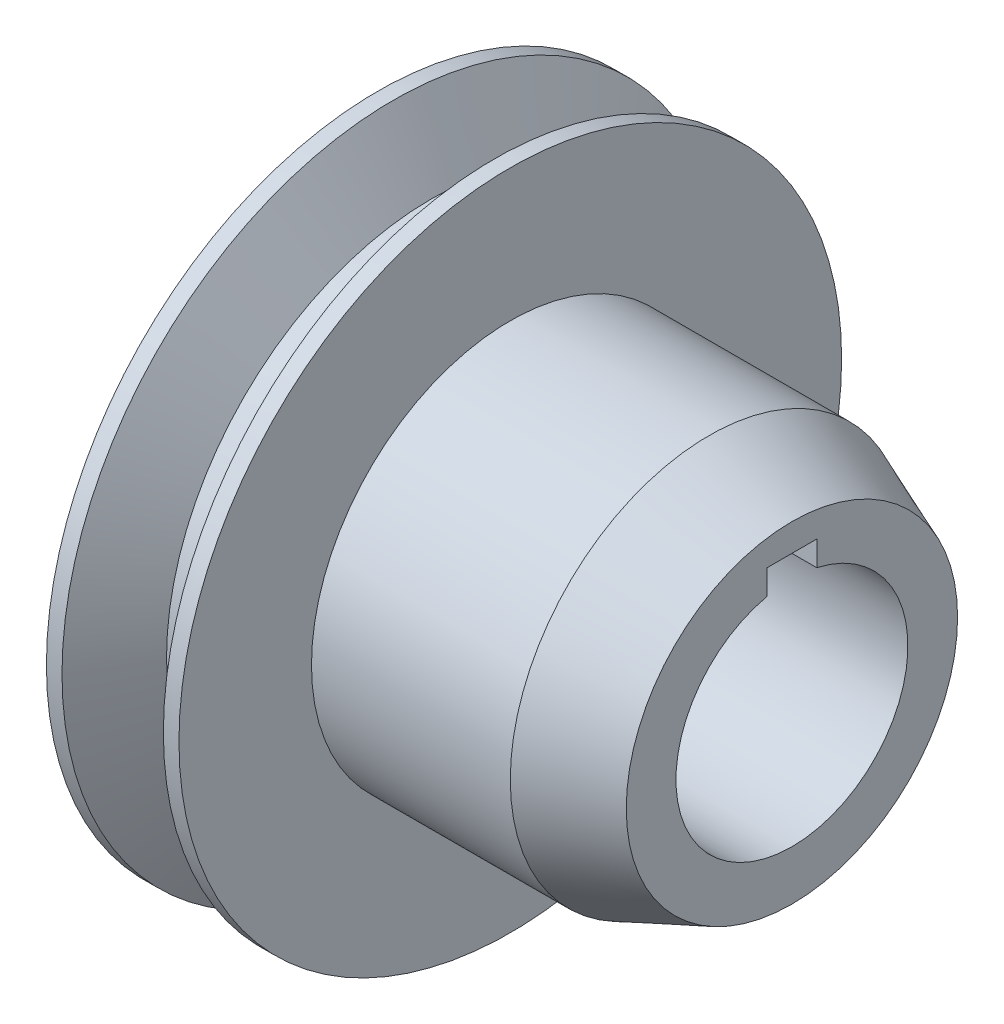
ISO-10303-21;
HEADER;
FILE_DESCRIPTION(('STEP AP214'),'2;1');
FILE_NAME('part.step','',(''),(''),'','','');
FILE_SCHEMA(('AUTOMOTIVE_DESIGN { 1 0 10303 214 1 1 1 1 }'));
ENDSEC;
DATA;
#1=APPLICATION_CONTEXT('core data for automotive mechanical design processes');
#2=APPLICATION_PROTOCOL_DEFINITION('international standard','automotive_design',2000,#1);
#3=PRODUCT_CONTEXT('',#1,'mechanical');
#4=PRODUCT('Part','Part','',(#3));
#5=PRODUCT_RELATED_PRODUCT_CATEGORY('part','',(#4));
#6=PRODUCT_DEFINITION_FORMATION('','',#4);
#7=PRODUCT_DEFINITION_CONTEXT('part definition',#1,'design');
#8=PRODUCT_DEFINITION('design','',#6,#7);
#9=PRODUCT_DEFINITION_SHAPE('','',#8);
#10=(LENGTH_UNIT() NAMED_UNIT(*) SI_UNIT(.MILLI.,.METRE.));
#11=(NAMED_UNIT(*) PLANE_ANGLE_UNIT() SI_UNIT($,.RADIAN.));
#12=(NAMED_UNIT(*) SI_UNIT($,.STERADIAN.) SOLID_ANGLE_UNIT());
#13=UNCERTAINTY_MEASURE_WITH_UNIT(LENGTH_MEASURE(1.E-05),#10,'distance_accuracy_value','');
#14=(GEOMETRIC_REPRESENTATION_CONTEXT(3) GLOBAL_UNCERTAINTY_ASSIGNED_CONTEXT((#13)) GLOBAL_UNIT_ASSIGNED_CONTEXT((#10,
#11,#12)) REPRESENTATION_CONTEXT('',''));
#15=CARTESIAN_POINT('',(0.,0.,0.));
#16=DIRECTION('',(0.,0.,1.));
#17=DIRECTION('',(1.,0.,0.));
#18=AXIS2_PLACEMENT_3D('',#15,#16,#17);
#19=CARTESIAN_POINT('',(-19.7924924362667,0.,0.));
#20=DIRECTION('',(-1.,0.,0.));
#21=DIRECTION('',(0.,0.,1.));
#22=AXIS2_PLACEMENT_3D('',#19,#20,#21);
#23=CYLINDRICAL_SURFACE('',#22,20.);
#24=CARTESIAN_POINT('',(-4.,0.,0.));
#25=DIRECTION('',(-1.,0.,0.));
#26=DIRECTION('',(0.,0.,1.));
#27=AXIS2_PLACEMENT_3D('',#24,#25,#26);
#28=CIRCLE('',#27,20.);
#29=CARTESIAN_POINT('',(-4.,0.,20.));
#30=VERTEX_POINT('',#29);
#31=EDGE_CURVE('E11',#30,#30,#28,.T.);
#32=ORIENTED_EDGE('',*,*,#31,.F.);
#33=EDGE_LOOP('',(#32));
#34=FACE_BOUND('',#33,.T.);
#35=CARTESIAN_POINT('',(-3.05940107675851,0.,0.));
#36=DIRECTION('',(-1.,0.,0.));
#37=DIRECTION('',(0.,0.,1.));
#38=AXIS2_PLACEMENT_3D('',#35,#36,#37);
#39=CIRCLE('',#38,20.);
#40=CARTESIAN_POINT('',(-3.05940107675851,0.,20.));
#41=VERTEX_POINT('',#40);
#42=EDGE_CURVE('E127',#41,#41,#39,.T.);
#43=ORIENTED_EDGE('',*,*,#42,.T.);
#44=EDGE_LOOP('',(#43));
#45=FACE_BOUND('',#44,.T.);
#46=ADVANCED_FACE('F43',(#34,#45),#23,.T.);
#47=CARTESIAN_POINT('',(-4.,20.,0.));
#48=DIRECTION('',(1.,0.,0.));
#49=DIRECTION('',(0.,0.,-1.));
#50=AXIS2_PLACEMENT_3D('',#47,#48,#49);
#51=PLANE('',#50);
#52=CARTESIAN_POINT('',(-4.,0.,0.));
#53=DIRECTION('',(-1.,0.,0.));
#54=DIRECTION('',(0.,0.,1.));
#55=AXIS2_PLACEMENT_3D('',#52,#53,#54);
#56=CIRCLE('',#55,7.);
#57=CARTESIAN_POINT('',(-4.,6.83739716558867,-1.5));
#58=VERTEX_POINT('',#57);
#59=CARTESIAN_POINT('',(-4.,6.83739716558867,1.5));
#60=VERTEX_POINT('',#59);
#61=EDGE_CURVE('E118',#58,#60,#56,.T.);
#62=ORIENTED_EDGE('',*,*,#61,.F.);
#63=DIRECTION('',(0.,-1.,0.));
#64=VECTOR('',#63,1.);
#65=CARTESIAN_POINT('',(-4.,8.33739716558867,-1.5));
#66=LINE('',#65,#64);
#67=CARTESIAN_POINT('',(-4.,8.33739716558867,-1.5));
#68=VERTEX_POINT('',#67);
#69=EDGE_CURVE('E58',#68,#58,#66,.T.);
#70=ORIENTED_EDGE('',*,*,#69,.F.);
#71=DIRECTION('',(0.,0.,-1.));
#72=VECTOR('',#71,1.);
#73=CARTESIAN_POINT('',(-4.,8.33739716558867,-1.5));
#74=LINE('',#73,#72);
#75=CARTESIAN_POINT('',(-4.,8.33739716558867,1.5));
#76=VERTEX_POINT('',#75);
#77=EDGE_CURVE('E105',#76,#68,#74,.T.);
#78=ORIENTED_EDGE('',*,*,#77,.F.);
#79=DIRECTION('',(0.,1.,0.));
#80=VECTOR('',#79,1.);
#81=CARTESIAN_POINT('',(-4.,8.33739716558867,1.5));
#82=LINE('',#81,#80);
#83=EDGE_CURVE('E109',#60,#76,#82,.T.);
#84=ORIENTED_EDGE('',*,*,#83,.F.);
#85=EDGE_LOOP('',(#62,#70,#78,#84));
#86=FACE_BOUND('',#85,.T.);
#87=ORIENTED_EDGE('',*,*,#31,.T.);
#88=EDGE_LOOP('',(#87));
#89=FACE_BOUND('',#88,.T.);
#90=ADVANCED_FACE('F165',(#86,#89),#51,.F.);
#91=CARTESIAN_POINT('',(21.,10.,0.));
#92=DIRECTION('',(-1.,0.,0.));
#93=DIRECTION('',(0.,0.,1.));
#94=AXIS2_PLACEMENT_3D('',#91,#92,#93);
#95=PLANE('',#94);
#96=DIRECTION('',(0.,0.,-1.));
#97=VECTOR('',#96,1.);
#98=CARTESIAN_POINT('',(21.,8.33739716558867,-1.5));
#99=LINE('',#98,#97);
#100=CARTESIAN_POINT('',(21.,8.33739716558867,1.5));
#101=VERTEX_POINT('',#100);
#102=CARTESIAN_POINT('',(21.,8.33739716558867,-1.5));
#103=VERTEX_POINT('',#102);
#104=EDGE_CURVE('E93',#101,#103,#99,.T.);
#105=ORIENTED_EDGE('',*,*,#104,.T.);
#106=DIRECTION('',(0.,-1.,0.));
#107=VECTOR('',#106,1.);
#108=CARTESIAN_POINT('',(21.,8.33739716558867,-1.5));
#109=LINE('',#108,#107);
#110=CARTESIAN_POINT('',(21.,6.83739716558867,-1.5));
#111=VERTEX_POINT('',#110);
#112=EDGE_CURVE('E86',#103,#111,#109,.T.);
#113=ORIENTED_EDGE('',*,*,#112,.T.);
#114=CARTESIAN_POINT('',(21.,0.,0.));
#115=DIRECTION('',(-1.,0.,0.));
#116=DIRECTION('',(0.,0.,1.));
#117=AXIS2_PLACEMENT_3D('',#114,#115,#116);
#118=CIRCLE('',#117,7.);
#119=CARTESIAN_POINT('',(21.,6.83739716558867,1.5));
#120=VERTEX_POINT('',#119);
#121=EDGE_CURVE('E96',#111,#120,#118,.T.);
#122=ORIENTED_EDGE('',*,*,#121,.T.);
#123=DIRECTION('',(0.,1.,0.));
#124=VECTOR('',#123,1.);
#125=CARTESIAN_POINT('',(21.,8.33739716558867,1.5));
#126=LINE('',#125,#124);
#127=EDGE_CURVE('E66',#120,#101,#126,.T.);
#128=ORIENTED_EDGE('',*,*,#127,.T.);
#129=EDGE_LOOP('',(#105,#113,#122,#128));
#130=FACE_BOUND('',#129,.T.);
#131=CARTESIAN_POINT('',(21.,0.,0.));
#132=DIRECTION('',(-1.,0.,0.));
#133=DIRECTION('',(0.,0.,1.));
#134=AXIS2_PLACEMENT_3D('',#131,#132,#133);
#135=CIRCLE('',#134,10.);
#136=CARTESIAN_POINT('',(21.,0.,10.));
#137=VERTEX_POINT('',#136);
#138=EDGE_CURVE('E51',#137,#137,#135,.T.);
#139=ORIENTED_EDGE('',*,*,#138,.F.);
#140=EDGE_LOOP('',(#139));
#141=FACE_BOUND('',#140,.T.);
#142=ADVANCED_FACE('F101',(#130,#141),#95,.F.);
#143=CARTESIAN_POINT('',(21.,0.,0.));
#144=DIRECTION('',(-1.,0.,0.));
#145=DIRECTION('',(0.,0.,1.));
#146=AXIS2_PLACEMENT_3D('',#143,#144,#145);
#147=CONICAL_SURFACE('',#146,10.,0.380506377112365);
#148=CARTESIAN_POINT('',(16.,0.,0.));
#149=DIRECTION('',(-1.,0.,0.));
#150=DIRECTION('',(0.,0.,1.));
#151=AXIS2_PLACEMENT_3D('',#148,#149,#150);
#152=CIRCLE('',#151,12.);
#153=CARTESIAN_POINT('',(16.,0.,12.));
#154=VERTEX_POINT('',#153);
#155=EDGE_CURVE('E156',#154,#154,#152,.T.);
#156=ORIENTED_EDGE('',*,*,#155,.F.);
#157=EDGE_LOOP('',(#156));
#158=FACE_BOUND('',#157,.T.);
#159=ORIENTED_EDGE('',*,*,#138,.T.);
#160=EDGE_LOOP('',(#159));
#161=FACE_BOUND('',#160,.T.);
#162=ADVANCED_FACE('F163',(#158,#161),#147,.T.);
#163=CARTESIAN_POINT('',(-19.7924924362667,0.,0.));
#164=DIRECTION('',(-1.,0.,0.));
#165=DIRECTION('',(0.,0.,1.));
#166=AXIS2_PLACEMENT_3D('',#163,#164,#165);
#167=CYLINDRICAL_SURFACE('',#166,12.);
#168=CARTESIAN_POINT('',(4.,0.,0.));
#169=DIRECTION('',(-1.,0.,0.));
#170=DIRECTION('',(0.,0.,1.));
#171=AXIS2_PLACEMENT_3D('',#168,#169,#170);
#172=CIRCLE('',#171,12.);
#173=CARTESIAN_POINT('',(4.,0.,12.));
#174=VERTEX_POINT('',#173);
#175=EDGE_CURVE('E152',#174,#174,#172,.T.);
#176=ORIENTED_EDGE('',*,*,#175,.F.);
#177=EDGE_LOOP('',(#176));
#178=FACE_BOUND('',#177,.T.);
#179=ORIENTED_EDGE('',*,*,#155,.T.);
#180=EDGE_LOOP('',(#179));
#181=FACE_BOUND('',#180,.T.);
#182=ADVANCED_FACE('F171',(#178,#181),#167,.T.);
#183=CARTESIAN_POINT('',(4.,20.,0.));
#184=DIRECTION('',(-1.,0.,0.));
#185=DIRECTION('',(0.,0.,1.));
#186=AXIS2_PLACEMENT_3D('',#183,#184,#185);
#187=PLANE('',#186);
#188=CARTESIAN_POINT('',(4.,0.,0.));
#189=DIRECTION('',(-1.,0.,0.));
#190=DIRECTION('',(0.,0.,1.));
#191=AXIS2_PLACEMENT_3D('',#188,#189,#190);
#192=CIRCLE('',#191,20.);
#193=CARTESIAN_POINT('',(4.,0.,20.));
#194=VERTEX_POINT('',#193);
#195=EDGE_CURVE('E148',#194,#194,#192,.T.);
#196=ORIENTED_EDGE('',*,*,#195,.F.);
#197=EDGE_LOOP('',(#196));
#198=FACE_BOUND('',#197,.T.);
#199=ORIENTED_EDGE('',*,*,#175,.T.);
#200=EDGE_LOOP('',(#199));
#201=FACE_BOUND('',#200,.T.);
#202=ADVANCED_FACE('F204',(#198,#201),#187,.F.);
#203=CARTESIAN_POINT('',(-19.7924924362667,0.,0.));
#204=DIRECTION('',(-1.,0.,0.));
#205=DIRECTION('',(0.,0.,1.));
#206=AXIS2_PLACEMENT_3D('',#203,#204,#205);
#207=CYLINDRICAL_SURFACE('',#206,20.);
#208=CARTESIAN_POINT('',(3.05940107675851,0.,0.));
#209=DIRECTION('',(-1.,0.,0.));
#210=DIRECTION('',(0.,0.,1.));
#211=AXIS2_PLACEMENT_3D('',#208,#209,#210);
#212=CIRCLE('',#211,20.);
#213=CARTESIAN_POINT('',(3.05940107675851,0.,20.));
#214=VERTEX_POINT('',#213);
#215=EDGE_CURVE('E144',#214,#214,#212,.T.);
#216=ORIENTED_EDGE('',*,*,#215,.F.);
#217=EDGE_LOOP('',(#216));
#218=FACE_BOUND('',#217,.T.);
#219=ORIENTED_EDGE('',*,*,#195,.T.);
#220=EDGE_LOOP('',(#219));
#221=FACE_BOUND('',#220,.T.);
#222=ADVANCED_FACE('F198',(#218,#221),#207,.T.);
#223=CARTESIAN_POINT('',(3.05940107675851,0.,0.));
#224=DIRECTION('',(1.,0.,0.));
#225=DIRECTION('',(0.,0.,-1.));
#226=AXIS2_PLACEMENT_3D('',#223,#224,#225);
#227=CONICAL_SURFACE('',#226,20.,1.0471975511966);
#228=CARTESIAN_POINT('',(0.750000000000001,0.,0.));
#229=DIRECTION('',(-1.,0.,0.));
#230=DIRECTION('',(0.,0.,1.));
#231=AXIS2_PLACEMENT_3D('',#228,#229,#230);
#232=CIRCLE('',#231,16.);
#233=CARTESIAN_POINT('',(0.750000000000001,0.,16.));
#234=VERTEX_POINT('',#233);
#235=EDGE_CURVE('E140',#234,#234,#232,.T.);
#236=ORIENTED_EDGE('',*,*,#235,.F.);
#237=EDGE_LOOP('',(#236));
#238=FACE_BOUND('',#237,.T.);
#239=ORIENTED_EDGE('',*,*,#215,.T.);
#240=EDGE_LOOP('',(#239));
#241=FACE_BOUND('',#240,.T.);
#242=ADVANCED_FACE('F192',(#238,#241),#227,.T.);
#243=CARTESIAN_POINT('',(-19.7924924362667,0.,0.));
#244=DIRECTION('',(-1.,0.,0.));
#245=DIRECTION('',(0.,0.,1.));
#246=AXIS2_PLACEMENT_3D('',#243,#244,#245);
#247=CYLINDRICAL_SURFACE('',#246,16.);
#248=CARTESIAN_POINT('',(-0.750000000000001,0.,0.));
#249=DIRECTION('',(-1.,0.,0.));
#250=DIRECTION('',(0.,0.,1.));
#251=AXIS2_PLACEMENT_3D('',#248,#249,#250);
#252=CIRCLE('',#251,16.);
#253=CARTESIAN_POINT('',(-0.750000000000001,0.,16.));
#254=VERTEX_POINT('',#253);
#255=EDGE_CURVE('E136',#254,#254,#252,.T.);
#256=ORIENTED_EDGE('',*,*,#255,.F.);
#257=EDGE_LOOP('',(#256));
#258=FACE_BOUND('',#257,.T.);
#259=ORIENTED_EDGE('',*,*,#235,.T.);
#260=EDGE_LOOP('',(#259));
#261=FACE_BOUND('',#260,.T.);
#262=ADVANCED_FACE('F186',(#258,#261),#247,.T.);
#263=CARTESIAN_POINT('',(-0.750000000000001,0.,0.));
#264=DIRECTION('',(-1.,0.,0.));
#265=DIRECTION('',(0.,0.,1.));
#266=AXIS2_PLACEMENT_3D('',#263,#264,#265);
#267=CONICAL_SURFACE('',#266,16.,1.0471975511966);
#268=ORIENTED_EDGE('',*,*,#42,.F.);
#269=EDGE_LOOP('',(#268));
#270=FACE_BOUND('',#269,.T.);
#271=ORIENTED_EDGE('',*,*,#255,.T.);
#272=EDGE_LOOP('',(#271));
#273=FACE_BOUND('',#272,.T.);
#274=ADVANCED_FACE('F183',(#270,#273),#267,.T.);
#275=CARTESIAN_POINT('',(21.,8.33739716558867,-1.5));
#276=DIRECTION('',(0.,0.,-1.));
#277=DIRECTION('',(0.,1.,0.));
#278=AXIS2_PLACEMENT_3D('',#275,#276,#277);
#279=PLANE('',#278);
#280=ORIENTED_EDGE('',*,*,#69,.T.);
#281=DIRECTION('',(-1.,0.,0.));
#282=VECTOR('',#281,1.);
#283=CARTESIAN_POINT('',(21.,6.83739716558867,-1.5));
#284=LINE('',#283,#282);
#285=EDGE_CURVE('E82',#111,#58,#284,.T.);
#286=ORIENTED_EDGE('',*,*,#285,.F.);
#287=ORIENTED_EDGE('',*,*,#112,.F.);
#288=DIRECTION('',(-1.,0.,0.));
#289=VECTOR('',#288,1.);
#290=CARTESIAN_POINT('',(21.,8.33739716558867,-1.5));
#291=LINE('',#290,#289);
#292=EDGE_CURVE('E124',#103,#68,#291,.T.);
#293=ORIENTED_EDGE('',*,*,#292,.T.);
#294=EDGE_LOOP('',(#280,#286,#287,#293));
#295=FACE_BOUND('',#294,.T.);
#296=ADVANCED_FACE('F84',(#295),#279,.F.);
#297=CARTESIAN_POINT('',(21.,8.33739716558867,-1.5));
#298=DIRECTION('',(0.,1.,0.));
#299=DIRECTION('',(0.,0.,1.));
#300=AXIS2_PLACEMENT_3D('',#297,#298,#299);
#301=PLANE('',#300);
#302=ORIENTED_EDGE('',*,*,#77,.T.);
#303=ORIENTED_EDGE('',*,*,#292,.F.);
#304=ORIENTED_EDGE('',*,*,#104,.F.);
#305=DIRECTION('',(-1.,0.,0.));
#306=VECTOR('',#305,1.);
#307=CARTESIAN_POINT('',(21.,8.33739716558867,1.5));
#308=LINE('',#307,#306);
#309=EDGE_CURVE('E128',#101,#76,#308,.T.);
#310=ORIENTED_EDGE('',*,*,#309,.T.);
#311=EDGE_LOOP('',(#302,#303,#304,#310));
#312=FACE_BOUND('',#311,.T.);
#313=ADVANCED_FACE('F222',(#312),#301,.F.);
#314=CARTESIAN_POINT('',(21.,8.33739716558867,1.5));
#315=DIRECTION('',(0.,0.,1.));
#316=DIRECTION('',(0.,-1.,0.));
#317=AXIS2_PLACEMENT_3D('',#314,#315,#316);
#318=PLANE('',#317);
#319=ORIENTED_EDGE('',*,*,#83,.T.);
#320=ORIENTED_EDGE('',*,*,#309,.F.);
#321=ORIENTED_EDGE('',*,*,#127,.F.);
#322=DIRECTION('',(-1.,0.,0.));
#323=VECTOR('',#322,1.);
#324=CARTESIAN_POINT('',(21.,6.83739716558867,1.5));
#325=LINE('',#324,#323);
#326=EDGE_CURVE('E92',#120,#60,#325,.T.);
#327=ORIENTED_EDGE('',*,*,#326,.T.);
#328=EDGE_LOOP('',(#319,#320,#321,#327));
#329=FACE_BOUND('',#328,.T.);
#330=ADVANCED_FACE('F225',(#329),#318,.F.);
#331=CARTESIAN_POINT('',(21.,0.,0.));
#332=DIRECTION('',(-1.,0.,0.));
#333=DIRECTION('',(0.,0.,1.));
#334=AXIS2_PLACEMENT_3D('',#331,#332,#333);
#335=CYLINDRICAL_SURFACE('',#334,7.);
#336=ORIENTED_EDGE('',*,*,#61,.T.);
#337=ORIENTED_EDGE('',*,*,#326,.F.);
#338=ORIENTED_EDGE('',*,*,#121,.F.);
#339=ORIENTED_EDGE('',*,*,#285,.T.);
#340=EDGE_LOOP('',(#336,#337,#338,#339));
#341=FACE_BOUND('',#340,.T.);
#342=ADVANCED_FACE('F97',(#341),#335,.F.);
#343=CLOSED_SHELL('',(#46,#90,#142,#162,#182,#202,#222,#242,#262,#274,#296,#313,#330,#342));
#344=MANIFOLD_SOLID_BREP('B2',#343);
#345=ADVANCED_BREP_SHAPE_REPRESENTATION('',(#18,#344),#14);
#346=SHAPE_DEFINITION_REPRESENTATION(#9,#345);
ENDSEC;
END-ISO-10303-21;
